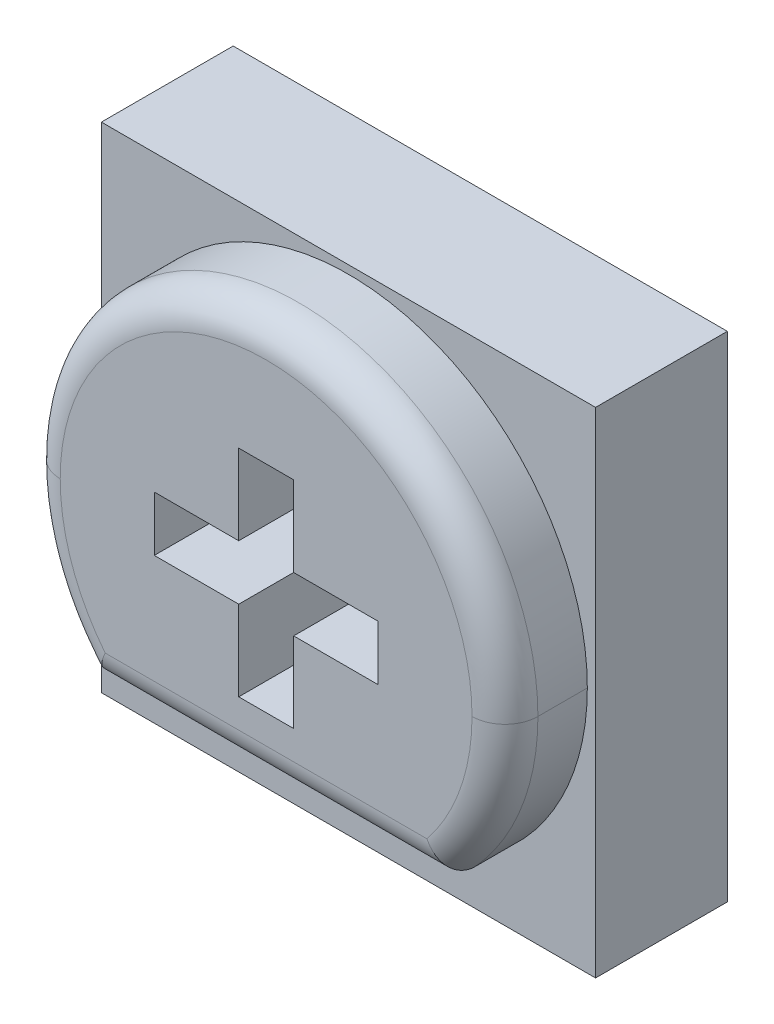
ISO-10303-21;
HEADER;
FILE_DESCRIPTION(('STEP AP214'),'2;1');
FILE_NAME('part.step','',(''),(''),'','','');
FILE_SCHEMA(('AUTOMOTIVE_DESIGN { 1 0 10303 214 1 1 1 1 }'));
ENDSEC;
DATA;
#1=APPLICATION_CONTEXT('core data for automotive mechanical design processes');
#2=APPLICATION_PROTOCOL_DEFINITION('international standard','automotive_design',2000,#1);
#3=PRODUCT_CONTEXT('',#1,'mechanical');
#4=PRODUCT('Part','Part','',(#3));
#5=PRODUCT_RELATED_PRODUCT_CATEGORY('part','',(#4));
#6=PRODUCT_DEFINITION_FORMATION('','',#4);
#7=PRODUCT_DEFINITION_CONTEXT('part definition',#1,'design');
#8=PRODUCT_DEFINITION('design','',#6,#7);
#9=PRODUCT_DEFINITION_SHAPE('','',#8);
#10=(LENGTH_UNIT() NAMED_UNIT(*) SI_UNIT(.MILLI.,.METRE.));
#11=(NAMED_UNIT(*) PLANE_ANGLE_UNIT() SI_UNIT($,.RADIAN.));
#12=(NAMED_UNIT(*) SI_UNIT($,.STERADIAN.) SOLID_ANGLE_UNIT());
#13=UNCERTAINTY_MEASURE_WITH_UNIT(LENGTH_MEASURE(1.E-05),#10,'distance_accuracy_value','');
#14=(GEOMETRIC_REPRESENTATION_CONTEXT(3) GLOBAL_UNCERTAINTY_ASSIGNED_CONTEXT((#13)) GLOBAL_UNIT_ASSIGNED_CONTEXT((#10,
#11,#12)) REPRESENTATION_CONTEXT('',''));
#15=CARTESIAN_POINT('',(0.,0.,0.));
#16=DIRECTION('',(0.,0.,1.));
#17=DIRECTION('',(1.,0.,0.));
#18=AXIS2_PLACEMENT_3D('',#15,#16,#17);
#19=CARTESIAN_POINT('',(0.,-0.780072673595366,1.1));
#20=DIRECTION('',(-1.,0.,0.));
#21=DIRECTION('',(0.,0.,1.));
#22=AXIS2_PLACEMENT_3D('',#19,#20,#21);
#23=CYLINDRICAL_SURFACE('',#22,0.2);
#24=CARTESIAN_POINT('',(-0.976722388353635,-0.780072673595365,1.3));
#25=CARTESIAN_POINT('',(-0.978582876483748,-0.783942428368407,1.30000010662705));
#26=CARTESIAN_POINT('',(-0.980434260622077,-0.78781661448682,1.29988768903877));
#27=CARTESIAN_POINT('',(-0.984068042853532,-0.795458200461184,1.29944304979156));
#28=CARTESIAN_POINT('',(-0.985850965291465,-0.799225697195105,1.29911675995361));
#29=CARTESIAN_POINT('',(-0.989347843964978,-0.806642878237111,1.29826139361799));
#30=CARTESIAN_POINT('',(-0.991062353450871,-0.810292968678736,1.29773810206317));
#31=CARTESIAN_POINT('',(-0.994422362316653,-0.817466103886795,1.29650597830426));
#32=CARTESIAN_POINT('',(-0.996068448082956,-0.820989839335476,1.29580276514015));
#33=CARTESIAN_POINT('',(-0.99929157862629,-0.827902752270505,1.2942279225682));
#34=CARTESIAN_POINT('',(-1.00086924541687,-0.831292879546459,1.29336173521145));
#35=CARTESIAN_POINT('',(-1.00395549999645,-0.837932673977716,1.29147786693144));
#36=CARTESIAN_POINT('',(-1.00546474880103,-0.841183524907789,1.29046544105349));
#37=CARTESIAN_POINT('',(-1.00841412701953,-0.847540366899465,1.2883056886341));
#38=CARTESIAN_POINT('',(-1.0098549600783,-0.850647750876924,1.28716342280461));
#39=CARTESIAN_POINT('',(-1.01266746221992,-0.856714648619868,1.28476015854547));
#40=CARTESIAN_POINT('',(-1.01403988169881,-0.859675740092966,1.28350402122508));
#41=CARTESIAN_POINT('',(-1.01671550807114,-0.865448317772886,1.28088867341865));
#42=CARTESIAN_POINT('',(-1.01801951673766,-0.868261542747201,1.2795341211797));
#43=CARTESIAN_POINT('',(-1.020558267061,-0.873737813577702,1.27673702595328));
#44=CARTESIAN_POINT('',(-1.0217938671395,-0.87640273625624,1.27529893690218));
#45=CARTESIAN_POINT('',(-1.02419574348245,-0.881582875907218,1.2723492192877));
#46=CARTESIAN_POINT('',(-1.02536294065438,-0.884100085606861,1.27084184051065));
#47=CARTESIAN_POINT('',(-1.02762793684647,-0.888986211856132,1.26776731866267));
#48=CARTESIAN_POINT('',(-1.02872672641301,-0.891357215696295,1.26620422292511));
#49=CARTESIAN_POINT('',(-1.03085486556617,-0.895953164103536,1.2630313446476));
#50=CARTESIAN_POINT('',(-1.0318852816206,-0.89818027050945,1.26142540961838));
#51=CARTESIAN_POINT('',(-1.03387648360047,-0.902491410532901,1.25817918009891));
#52=CARTESIAN_POINT('',(-1.03483842596946,-0.904577660235075,1.25654253817552));
#53=CARTESIAN_POINT('',(-1.03669297457826,-0.908610602077788,1.25324657414484));
#54=CARTESIAN_POINT('',(-1.03758681830135,-0.910559550071438,1.25159071105662));
#55=CARTESIAN_POINT('',(-1.03930371780735,-0.914322275004737,1.24826693579304));
#56=CARTESIAN_POINT('',(-1.04012817324538,-0.916138316812218,1.24660230690265));
#57=CARTESIAN_POINT('',(-1.04208567220707,-0.920467707669937,1.24248344323641));
#58=CARTESIAN_POINT('',(-1.04320256258946,-0.92295287236982,1.2399917319032));
#59=CARTESIAN_POINT('',(-1.04536496724724,-0.927774414297937,1.23489394935906));
#60=CARTESIAN_POINT('',(-1.04641111392838,-0.930112092085159,1.2322893749379));
#61=CARTESIAN_POINT('',(-1.04843029420529,-0.934634917492007,1.2269746384858));
#62=CARTESIAN_POINT('',(-1.04940397694238,-0.936821402459521,1.22426586224713));
#63=CARTESIAN_POINT('',(-1.05127868942366,-0.941038002898474,1.21875219984313));
#64=CARTESIAN_POINT('',(-1.05218036051133,-0.943069489212293,1.21594858036964));
#65=CARTESIAN_POINT('',(-1.05391093247813,-0.946973003780872,1.21025459026027));
#66=CARTESIAN_POINT('',(-1.05474047116892,-0.948846424068253,1.20736536822005));
#67=CARTESIAN_POINT('',(-1.05632681553256,-0.952431234553708,1.20150958775003));
#68=CARTESIAN_POINT('',(-1.05708425216595,-0.954144027943474,1.19854405959484));
#69=CARTESIAN_POINT('',(-1.05852639114481,-0.95740557790085,1.19254505067602));
#70=CARTESIAN_POINT('',(-1.05921171610998,-0.958955738244561,1.18951248310666));
#71=CARTESIAN_POINT('',(-1.06050964303854,-0.961890552710986,1.18338873191873));
#72=CARTESIAN_POINT('',(-1.06112285719928,-0.963276600909639,1.18029834643786));
#73=CARTESIAN_POINT('',(-1.06227657301095,-0.965882249336626,1.17406821561177));
#74=CARTESIAN_POINT('',(-1.06281767439884,-0.967103223843364,1.17092915633339));
#75=CARTESIAN_POINT('',(-1.06382717800542,-0.969378294595384,1.16461082689027));
#76=CARTESIAN_POINT('',(-1.06429616535711,-0.970433735552373,1.16143213461483));
#77=CARTESIAN_POINT('',(-1.06516145616436,-0.972377803862266,1.15504355425207));
#78=CARTESIAN_POINT('',(-1.06555832795597,-0.973267737004709,1.15183414067152));
#79=CARTESIAN_POINT('',(-1.06627940532571,-0.974881332832962,1.14539297440089));
#80=CARTESIAN_POINT('',(-1.06660416020488,-0.975606253530085,1.14216159849668));
#81=CARTESIAN_POINT('',(-1.06718102316413,-0.976890822910636,1.13568518165773));
#82=CARTESIAN_POINT('',(-1.0674336592554,-0.977451673609748,1.13244042628605));
#83=CARTESIAN_POINT('',(-1.06786630821027,-0.978409553964949,1.12594572403494));
#84=CARTESIAN_POINT('',(-1.06804682552164,-0.978807721995891,1.12269597874226));
#85=CARTESIAN_POINT('',(-1.06833525580482,-0.979442058057056,1.11619953598342));
#86=CARTESIAN_POINT('',(-1.06844364747126,-0.97967929439247,1.11295296417933));
#87=CARTESIAN_POINT('',(-1.06858787325372,-0.979994166377215,1.10647090549435));
#88=CARTESIAN_POINT('',(-1.06862415795581,-0.980072793201553,1.10323547670629));
#89=CARTESIAN_POINT('',(-1.06862414088005,-0.980072673595366,1.1));
#90=B_SPLINE_CURVE_WITH_KNOTS('',3,(#24,#25,#26,#27,#28,#29,#30,#31,#32,#33,#34,#35,#36,#37,#38,
#39,#40,#41,#42,#43,#44,#45,#46,#47,#48,#49,#50,#51,#52,#53,#54,#55,#56,#57,#58,#59,#60,#61,#62,
#63,#64,#65,#66,#67,#68,#69,#70,#71,#72,#73,#74,#75,#76,#77,#78,#79,#80,#81,#82,#83,#84,#85,#86,
#87,#88,#89),.UNSPECIFIED.,.F.,.F.,(4,2,2,2,2,2,2,2,2,2,2,2,2,2,2,2,2,2,2,2,2,2,2,2,2,2,2,2,2,2,
2,2,4),(0.,0.0128798643907271,0.0254168111871587,0.0376111761819841,0.0494633248166605,
0.0609736556606268,0.0721426044121531,0.0829706485163055,0.0934583125162377,0.103606174279954,
0.113414872277339,0.122885114123568,0.13201768665766,0.140813467892352,0.149273441258434,
0.157398712679542,0.165190531160782,0.176261521102339,0.187214853640435,0.198053862441838,
0.208781987753394,0.219402777577811,0.229919888553356,0.240337086503167,0.250658246619516,
0.260887353248586,0.271028499242076,0.281085884843466,0.291063816078963,0.300966702626154,
0.310799055137271,0.320565481998601,0.330270685513171),.UNSPECIFIED.);
#91=CARTESIAN_POINT('',(-0.976722388353635,-0.780072673594436,1.3));
#92=VERTEX_POINT('',#91);
#93=CARTESIAN_POINT('',(-1.06862414088005,-0.980072673595366,1.1));
#94=VERTEX_POINT('',#93);
#95=EDGE_CURVE('E11',#92,#94,#90,.T.);
#96=ORIENTED_EDGE('',*,*,#95,.T.);
#97=DIRECTION('',(-1.,0.,0.));
#98=VECTOR('',#97,1.);
#99=CARTESIAN_POINT('',(-1.06862414088005,-0.980072673595366,1.1));
#100=LINE('',#99,#98);
#101=CARTESIAN_POINT('',(1.06862414088005,-0.980072673595366,1.1));
#102=VERTEX_POINT('',#101);
#103=EDGE_CURVE('E307',#102,#94,#100,.T.);
#104=ORIENTED_EDGE('',*,*,#103,.F.);
#105=CARTESIAN_POINT('',(1.06862414088005,-0.980072673595366,1.1));
#106=CARTESIAN_POINT('',(1.06862415790463,-0.980072793161405,1.10323501885855));
#107=CARTESIAN_POINT('',(1.06858787014738,-0.979994188595952,1.10646998968196));
#108=CARTESIAN_POINT('',(1.06844363555318,-0.979679401920801,1.11295121111512));
#109=CARTESIAN_POINT('',(1.06833523638055,-0.979442225082035,1.11619740342594));
#110=CARTESIAN_POINT('',(1.06804678841329,-0.978808037915209,1.12269316798305));
#111=CARTESIAN_POINT('',(1.0678662592102,-0.978409955695832,1.12594261415052));
#112=CARTESIAN_POINT('',(1.06743358374542,-0.977452265705593,1.13243680007929));
#113=CARTESIAN_POINT('',(1.06718093136514,-0.976891515961146,1.13568133762672));
#114=CARTESIAN_POINT('',(1.06660403306032,-0.975607155967753,1.14215740077891));
#115=CARTESIAN_POINT('',(1.06627925750309,-0.974882340106026,1.14538863998265));
#116=CARTESIAN_POINT('',(1.06555813595711,-0.973268950131116,1.15182961374495));
#117=CARTESIAN_POINT('',(1.06516123910061,-0.972379114426444,1.15503897047008));
#118=CARTESIAN_POINT('',(1.06429589528706,-0.970435225948222,1.1614275158165));
#119=CARTESIAN_POINT('',(1.0638268784866,-0.969379863836404,1.16460622867592));
#120=CARTESIAN_POINT('',(1.06281731304553,-0.967104924671163,1.17092467464717));
#121=CARTESIAN_POINT('',(1.06227617782755,-0.965883999402918,1.17406382840996));
#122=CARTESIAN_POINT('',(1.06112239135304,-0.963278412559076,1.18029421909145));
#123=CARTESIAN_POINT('',(1.06050913898096,-0.961892373261247,1.18338476828253));
#124=CARTESIAN_POINT('',(1.0592111325665,-0.95895752928339,1.1895089121736));
#125=CARTESIAN_POINT('',(1.05852576501605,-0.957407327156057,1.19254170687831));
#126=CARTESIAN_POINT('',(1.05708353771209,-0.954145636384646,1.19854122862351));
#127=CARTESIAN_POINT('',(1.05632605409692,-0.952432740678393,1.20150704041988));
#128=CARTESIAN_POINT('',(1.0547396126331,-0.948847658937547,1.20736343893423));
#129=CARTESIAN_POINT('',(1.05391002265254,-0.946974066522486,1.21025299314087));
#130=CARTESIAN_POINT('',(1.05217934456879,-0.943070132493851,1.21594768939739));
#131=CARTESIAN_POINT('',(1.05127761754805,-0.941038395769432,1.21875168043219));
#132=CARTESIAN_POINT('',(1.04940279085237,-0.936821211132242,1.22426611817609));
#133=CARTESIAN_POINT('',(1.04842904881215,-0.934634389416236,1.2269752956015));
#134=CARTESIAN_POINT('',(1.04640974272993,-0.9301108013382,1.23229085469895));
#135=CARTESIAN_POINT('',(1.04536352853366,-0.927772694815,1.23489584780285));
#136=CARTESIAN_POINT('',(1.04320099975805,-0.922950195843846,1.23999448041842));
#137=CARTESIAN_POINT('',(1.04208405205195,-0.920464500110525,1.24248662025425));
#138=CARTESIAN_POINT('',(1.04012686911423,-0.916135158338833,1.24660522336567));
#139=CARTESIAN_POINT('',(1.03930281403785,-0.914319736746141,1.24826921929074));
#140=CARTESIAN_POINT('',(1.03758666070683,-0.910558219473953,1.25159184326611));
#141=CARTESIAN_POINT('',(1.03669315987989,-0.908609857860175,1.25324718532612));
#142=CARTESIAN_POINT('',(1.03483925419172,-0.904578045228244,1.25654222045205));
#143=CARTESIAN_POINT('',(1.03387760986934,-0.902492336966285,1.25817845171438));
#144=CARTESIAN_POINT('',(1.03188695733766,-0.898182228796339,1.26142396705059));
#145=CARTESIAN_POINT('',(1.03085679082111,-0.895955611292947,1.26302959550577));
#146=CARTESIAN_POINT('',(1.02872910483605,-0.891360580949605,1.26620196157212));
#147=CARTESIAN_POINT('',(1.02763051732048,-0.888990004620983,1.26776484837798));
#148=CARTESIAN_POINT('',(1.02536587881754,-0.884104665201275,1.270839045563));
#149=CARTESIAN_POINT('',(1.02419883589516,-0.881587813077026,1.27234630503816));
#150=CARTESIAN_POINT('',(1.02179722153228,-0.876408311980484,1.27529586827567));
#151=CARTESIAN_POINT('',(1.02056172797285,-0.87374366847777,1.27673391838907));
#152=CARTESIAN_POINT('',(1.01802314398466,-0.868267871349357,1.27953100960079));
#153=CARTESIAN_POINT('',(1.01671919407088,-0.865454839077353,1.28088559258959));
#154=CARTESIAN_POINT('',(1.01404363836945,-0.859682554624791,1.28350106399332));
#155=CARTESIAN_POINT('',(1.01267122987399,-0.856721561873554,1.28475728966257));
#156=CARTESIAN_POINT('',(1.00985870274354,-0.850654762627129,1.28716077953568));
#157=CARTESIAN_POINT('',(1.00841783288863,-0.84754737668662,1.28830317779404));
#158=CARTESIAN_POINT('',(1.00546833401955,-0.841190426044895,1.29046322940207));
#159=CARTESIAN_POINT('',(1.00395900063283,-0.837939466802953,1.2914758168573));
#160=CARTESIAN_POINT('',(1.00087252974065,-0.83129934649203,1.29336002667376));
#161=CARTESIAN_POINT('',(0.999294730575505,-0.827909000186218,1.29422638845632));
#162=CARTESIAN_POINT('',(0.996071288057848,-0.820995536908047,1.29580158102119));
#163=CARTESIAN_POINT('',(0.994425022120679,-0.817471468899134,1.29650496386808));
#164=CARTESIAN_POINT('',(0.991064605615255,-0.810297555034523,1.29773740971588));
#165=CARTESIAN_POINT('',(0.989349868153072,-0.806647017519145,1.29826084744706));
#166=CARTESIAN_POINT('',(0.985852486187445,-0.799228829574676,1.29911646938995));
#167=CARTESIAN_POINT('',(0.984069287982963,-0.795460772360033,1.29944286209294));
#168=CARTESIAN_POINT('',(0.980434906754333,-0.787817955794568,1.29988765009065));
#169=CARTESIAN_POINT('',(0.978583198980793,-0.783943099296896,1.30000010668523));
#170=CARTESIAN_POINT('',(0.976722388353635,-0.780072673595365,1.3));
#171=B_SPLINE_CURVE_WITH_KNOTS('',3,(#105,#106,#107,#108,#109,#110,#111,#112,#113,#114,#115,
#116,#117,#118,#119,#120,#121,#122,#123,#124,#125,#126,#127,#128,#129,#130,#131,#132,#133,#134,
#135,#136,#137,#138,#139,#140,#141,#142,#143,#144,#145,#146,#147,#148,#149,#150,#151,#152,#153,
#154,#155,#156,#157,#158,#159,#160,#161,#162,#163,#164,#165,#166,#167,#168,#169,#170),
.UNSPECIFIED.,.F.,.F.,(4,2,2,2,2,2,2,2,2,2,2,2,2,2,2,2,2,2,2,2,2,2,2,2,2,2,2,2,2,2,2,2,4),(0.,
0.00970383015639041,0.0194691111408278,0.0293005460425884,0.0392027436866783,0.0491802148332466,
0.0592373689551338,0.0693785115803201,0.0796078421805294,0.0899294525825833,0.100347325875266,
0.110865335781494,0.121487246463379,0.132216712726339,0.143057280587636,0.154012388174575,
0.165085366917928,0.172874288339563,0.180997000652246,0.18945475428177,0.198248656233392,
0.207379690754197,0.216848736464828,0.226656580648037,0.236803931233077,0.247291426901338,
0.258119645651113,0.269289112091529,0.280800303682738,0.292653656097926,0.304849567849835,
0.317388404298482,0.33027050113589),.UNSPECIFIED.);
#172=CARTESIAN_POINT('',(0.976722388353635,-0.780072673594436,1.3));
#173=VERTEX_POINT('',#172);
#174=EDGE_CURVE('E258',#102,#173,#171,.T.);
#175=ORIENTED_EDGE('',*,*,#174,.T.);
#176=DIRECTION('',(1.,0.,0.));
#177=VECTOR('',#176,1.);
#178=CARTESIAN_POINT('',(1.06862414088005,-0.780072673595366,1.3));
#179=LINE('',#178,#177);
#180=EDGE_CURVE('E466',#92,#173,#179,.T.);
#181=ORIENTED_EDGE('',*,*,#180,.F.);
#182=EDGE_LOOP('',(#96,#104,#175,#181));
#183=FACE_BOUND('',#182,.T.);
#184=ADVANCED_FACE('F16',(#183),#23,.T.);
#185=CARTESIAN_POINT('',(0.,0.,1.1));
#186=DIRECTION('',(0.,0.,1.));
#187=DIRECTION('',(1.,0.,0.));
#188=AXIS2_PLACEMENT_3D('',#185,#186,#187);
#189=TOROIDAL_SURFACE('',#188,1.25,0.2);
#190=CARTESIAN_POINT('',(-1.25,0.,1.1));
#191=DIRECTION('',(0.,1.,0.));
#192=DIRECTION('',(-1.,0.,0.));
#193=AXIS2_PLACEMENT_3D('',#190,#191,#192);
#194=CIRCLE('',#193,0.2);
#195=CARTESIAN_POINT('',(-1.45,0.,1.1));
#196=VERTEX_POINT('',#195);
#197=CARTESIAN_POINT('',(-1.25,0.,1.3));
#198=VERTEX_POINT('',#197);
#199=EDGE_CURVE('E428',#196,#198,#194,.T.);
#200=ORIENTED_EDGE('',*,*,#199,.F.);
#201=CARTESIAN_POINT('',(0.,0.,1.1));
#202=DIRECTION('',(0.,0.,-1.));
#203=DIRECTION('',(1.,0.,0.));
#204=AXIS2_PLACEMENT_3D('',#201,#202,#203);
#205=CIRCLE('',#204,1.45);
#206=EDGE_CURVE('E583',#94,#196,#205,.T.);
#207=ORIENTED_EDGE('',*,*,#206,.F.);
#208=ORIENTED_EDGE('',*,*,#95,.F.);
#209=CARTESIAN_POINT('',(0.,0.,1.3));
#210=DIRECTION('',(0.,0.,1.));
#211=DIRECTION('',(1.,0.,0.));
#212=AXIS2_PLACEMENT_3D('',#209,#210,#211);
#213=CIRCLE('',#212,1.25);
#214=EDGE_CURVE('E601',#198,#92,#213,.T.);
#215=ORIENTED_EDGE('',*,*,#214,.F.);
#216=EDGE_LOOP('',(#200,#207,#208,#215));
#217=FACE_BOUND('',#216,.T.);
#218=ADVANCED_FACE('F235',(#217),#189,.T.);
#219=CARTESIAN_POINT('',(0.,0.,0.5));
#220=DIRECTION('',(0.,0.,1.));
#221=DIRECTION('',(1.,0.,0.));
#222=AXIS2_PLACEMENT_3D('',#219,#220,#221);
#223=PLANE('',#222);
#224=DIRECTION('',(1.,0.,0.));
#225=VECTOR('',#224,1.);
#226=CARTESIAN_POINT('',(-0.6790503810102,0.215595899480311,0.5));
#227=LINE('',#226,#225);
#228=CARTESIAN_POINT('',(-0.6790503810102,0.215595899480311,0.5));
#229=VERTEX_POINT('',#228);
#230=CARTESIAN_POINT('',(-0.166229868189688,0.215595899480311,0.5));
#231=VERTEX_POINT('',#230);
#232=EDGE_CURVE('E353',#229,#231,#227,.T.);
#233=ORIENTED_EDGE('',*,*,#232,.F.);
#234=DIRECTION('',(0.,1.,0.));
#235=VECTOR('',#234,1.);
#236=CARTESIAN_POINT('',(-0.6790503810102,-0.117737433853022,0.5));
#237=LINE('',#236,#235);
#238=CARTESIAN_POINT('',(-0.6790503810102,-0.117737433853022,0.5));
#239=VERTEX_POINT('',#238);
#240=EDGE_CURVE('E27',#239,#229,#237,.T.);
#241=ORIENTED_EDGE('',*,*,#240,.F.);
#242=DIRECTION('',(-1.,0.,0.));
#243=VECTOR('',#242,1.);
#244=CARTESIAN_POINT('',(-0.166229868189688,-0.117737433853022,0.5));
#245=LINE('',#244,#243);
#246=CARTESIAN_POINT('',(-0.166229868189688,-0.117737433853022,0.5));
#247=VERTEX_POINT('',#246);
#248=EDGE_CURVE('E357',#247,#239,#245,.T.);
#249=ORIENTED_EDGE('',*,*,#248,.F.);
#250=DIRECTION('',(0.,1.,0.));
#251=VECTOR('',#250,1.);
#252=CARTESIAN_POINT('',(-0.166229868189688,-0.60491692103251,0.5));
#253=LINE('',#252,#251);
#254=CARTESIAN_POINT('',(-0.166229868189688,-0.60491692103251,0.5));
#255=VERTEX_POINT('',#254);
#256=EDGE_CURVE('E341',#255,#247,#253,.T.);
#257=ORIENTED_EDGE('',*,*,#256,.F.);
#258=DIRECTION('',(-1.,0.,0.));
#259=VECTOR('',#258,1.);
#260=CARTESIAN_POINT('',(0.167103465143646,-0.60491692103251,0.5));
#261=LINE('',#260,#259);
#262=CARTESIAN_POINT('',(0.167103465143646,-0.60491692103251,0.5));
#263=VERTEX_POINT('',#262);
#264=EDGE_CURVE('E330',#263,#255,#261,.T.);
#265=ORIENTED_EDGE('',*,*,#264,.F.);
#266=DIRECTION('',(0.,-1.,0.));
#267=VECTOR('',#266,1.);
#268=CARTESIAN_POINT('',(0.167103465143646,-0.117737433853022,0.5));
#269=LINE('',#268,#267);
#270=CARTESIAN_POINT('',(0.167103465143646,-0.117737433853022,0.5));
#271=VERTEX_POINT('',#270);
#272=EDGE_CURVE('E386',#271,#263,#269,.T.);
#273=ORIENTED_EDGE('',*,*,#272,.F.);
#274=DIRECTION('',(-1.,0.,0.));
#275=VECTOR('',#274,1.);
#276=CARTESIAN_POINT('',(0.679923977964159,-0.117737433853022,0.5));
#277=LINE('',#276,#275);
#278=CARTESIAN_POINT('',(0.679923977964159,-0.117737433853022,0.5));
#279=VERTEX_POINT('',#278);
#280=EDGE_CURVE('E184',#279,#271,#277,.T.);
#281=ORIENTED_EDGE('',*,*,#280,.F.);
#282=DIRECTION('',(0.,-1.,0.));
#283=VECTOR('',#282,1.);
#284=CARTESIAN_POINT('',(0.679923977964159,0.215595899480311,0.5));
#285=LINE('',#284,#283);
#286=CARTESIAN_POINT('',(0.679923977964159,0.215595899480311,0.5));
#287=VERTEX_POINT('',#286);
#288=EDGE_CURVE('E175',#287,#279,#285,.T.);
#289=ORIENTED_EDGE('',*,*,#288,.F.);
#290=DIRECTION('',(1.,0.,0.));
#291=VECTOR('',#290,1.);
#292=CARTESIAN_POINT('',(0.167103465143646,0.215595899480311,0.5));
#293=LINE('',#292,#291);
#294=CARTESIAN_POINT('',(0.167103465143646,0.215595899480311,0.5));
#295=VERTEX_POINT('',#294);
#296=EDGE_CURVE('E180',#295,#287,#293,.T.);
#297=ORIENTED_EDGE('',*,*,#296,.F.);
#298=DIRECTION('',(0.,-1.,0.));
#299=VECTOR('',#298,1.);
#300=CARTESIAN_POINT('',(0.167103465143646,0.702775386659798,0.5));
#301=LINE('',#300,#299);
#302=CARTESIAN_POINT('',(0.167103465143646,0.702775386659798,0.5));
#303=VERTEX_POINT('',#302);
#304=EDGE_CURVE('E211',#303,#295,#301,.T.);
#305=ORIENTED_EDGE('',*,*,#304,.F.);
#306=DIRECTION('',(1.,0.,0.));
#307=VECTOR('',#306,1.);
#308=CARTESIAN_POINT('',(-0.166229868189688,0.702775386659798,0.5));
#309=LINE('',#308,#307);
#310=CARTESIAN_POINT('',(-0.166229868189688,0.702775386659798,0.5));
#311=VERTEX_POINT('',#310);
#312=EDGE_CURVE('E447',#311,#303,#309,.T.);
#313=ORIENTED_EDGE('',*,*,#312,.F.);
#314=DIRECTION('',(0.,1.,0.));
#315=VECTOR('',#314,1.);
#316=CARTESIAN_POINT('',(-0.166229868189688,0.215595899480311,0.5));
#317=LINE('',#316,#315);
#318=EDGE_CURVE('E352',#231,#311,#317,.T.);
#319=ORIENTED_EDGE('',*,*,#318,.F.);
#320=EDGE_LOOP('',(#233,#241,#249,#257,#265,#273,#281,#289,#297,#305,#313,#319));
#321=FACE_BOUND('',#320,.T.);
#322=ADVANCED_FACE('F177',(#321),#223,.T.);
#323=CARTESIAN_POINT('',(-0.6790503810102,-0.117737433853022,0.5));
#324=DIRECTION('',(1.,0.,0.));
#325=DIRECTION('',(0.,1.,0.));
#326=AXIS2_PLACEMENT_3D('',#323,#324,#325);
#327=PLANE('',#326);
#328=DIRECTION('',(0.,1.,0.));
#329=VECTOR('',#328,1.);
#330=CARTESIAN_POINT('',(-0.6790503810102,-0.117737433853022,1.3));
#331=LINE('',#330,#329);
#332=CARTESIAN_POINT('',(-0.6790503810102,-0.117737433853022,1.3));
#333=VERTEX_POINT('',#332);
#334=CARTESIAN_POINT('',(-0.6790503810102,0.215595899480311,1.3));
#335=VERTEX_POINT('',#334);
#336=EDGE_CURVE('E380',#333,#335,#331,.T.);
#337=ORIENTED_EDGE('',*,*,#336,.F.);
#338=DIRECTION('',(0.,0.,1.));
#339=VECTOR('',#338,1.);
#340=CARTESIAN_POINT('',(-0.6790503810102,-0.117737433853022,0.5));
#341=LINE('',#340,#339);
#342=EDGE_CURVE('E354',#239,#333,#341,.T.);
#343=ORIENTED_EDGE('',*,*,#342,.F.);
#344=ORIENTED_EDGE('',*,*,#240,.T.);
#345=DIRECTION('',(0.,0.,1.));
#346=VECTOR('',#345,1.);
#347=CARTESIAN_POINT('',(-0.6790503810102,0.215595899480311,0.5));
#348=LINE('',#347,#346);
#349=EDGE_CURVE('E317',#229,#335,#348,.T.);
#350=ORIENTED_EDGE('',*,*,#349,.T.);
#351=EDGE_LOOP('',(#337,#343,#344,#350));
#352=FACE_BOUND('',#351,.T.);
#353=ADVANCED_FACE('F290',(#352),#327,.T.);
#354=CARTESIAN_POINT('',(-0.166229868189688,-0.117737433853022,0.5));
#355=DIRECTION('',(0.,1.,0.));
#356=DIRECTION('',(1.,0.,0.));
#357=AXIS2_PLACEMENT_3D('',#354,#355,#356);
#358=PLANE('',#357);
#359=DIRECTION('',(-1.,0.,0.));
#360=VECTOR('',#359,1.);
#361=CARTESIAN_POINT('',(-0.166229868189688,-0.117737433853022,1.3));
#362=LINE('',#361,#360);
#363=CARTESIAN_POINT('',(-0.166229868189688,-0.117737433853022,1.3));
#364=VERTEX_POINT('',#363);
#365=EDGE_CURVE('E370',#364,#333,#362,.T.);
#366=ORIENTED_EDGE('',*,*,#365,.F.);
#367=DIRECTION('',(0.,0.,1.));
#368=VECTOR('',#367,1.);
#369=CARTESIAN_POINT('',(-0.166229868189688,-0.117737433853022,0.5));
#370=LINE('',#369,#368);
#371=EDGE_CURVE('E439',#247,#364,#370,.T.);
#372=ORIENTED_EDGE('',*,*,#371,.F.);
#373=ORIENTED_EDGE('',*,*,#248,.T.);
#374=ORIENTED_EDGE('',*,*,#342,.T.);
#375=EDGE_LOOP('',(#366,#372,#373,#374));
#376=FACE_BOUND('',#375,.T.);
#377=ADVANCED_FACE('F286',(#376),#358,.T.);
#378=CARTESIAN_POINT('',(-0.166229868189688,-0.60491692103251,0.5));
#379=DIRECTION('',(1.,0.,0.));
#380=DIRECTION('',(0.,1.,0.));
#381=AXIS2_PLACEMENT_3D('',#378,#379,#380);
#382=PLANE('',#381);
#383=DIRECTION('',(0.,1.,0.));
#384=VECTOR('',#383,1.);
#385=CARTESIAN_POINT('',(-0.166229868189688,-0.60491692103251,1.3));
#386=LINE('',#385,#384);
#387=CARTESIAN_POINT('',(-0.166229868189688,-0.60491692103251,1.3));
#388=VERTEX_POINT('',#387);
#389=EDGE_CURVE('E494',#388,#364,#386,.T.);
#390=ORIENTED_EDGE('',*,*,#389,.F.);
#391=DIRECTION('',(0.,0.,1.));
#392=VECTOR('',#391,1.);
#393=CARTESIAN_POINT('',(-0.166229868189688,-0.60491692103251,0.5));
#394=LINE('',#393,#392);
#395=EDGE_CURVE('E334',#255,#388,#394,.T.);
#396=ORIENTED_EDGE('',*,*,#395,.F.);
#397=ORIENTED_EDGE('',*,*,#256,.T.);
#398=ORIENTED_EDGE('',*,*,#371,.T.);
#399=EDGE_LOOP('',(#390,#396,#397,#398));
#400=FACE_BOUND('',#399,.T.);
#401=ADVANCED_FACE('F289',(#400),#382,.T.);
#402=CARTESIAN_POINT('',(0.167103465143646,-0.60491692103251,0.5));
#403=DIRECTION('',(0.,1.,0.));
#404=DIRECTION('',(1.,0.,0.));
#405=AXIS2_PLACEMENT_3D('',#402,#403,#404);
#406=PLANE('',#405);
#407=DIRECTION('',(-1.,0.,0.));
#408=VECTOR('',#407,1.);
#409=CARTESIAN_POINT('',(0.167103465143646,-0.60491692103251,1.3));
#410=LINE('',#409,#408);
#411=CARTESIAN_POINT('',(0.167103465143646,-0.60491692103251,1.3));
#412=VERTEX_POINT('',#411);
#413=EDGE_CURVE('E436',#412,#388,#410,.T.);
#414=ORIENTED_EDGE('',*,*,#413,.F.);
#415=DIRECTION('',(0.,0.,1.));
#416=VECTOR('',#415,1.);
#417=CARTESIAN_POINT('',(0.167103465143646,-0.60491692103251,0.5));
#418=LINE('',#417,#416);
#419=EDGE_CURVE('E335',#263,#412,#418,.T.);
#420=ORIENTED_EDGE('',*,*,#419,.F.);
#421=ORIENTED_EDGE('',*,*,#264,.T.);
#422=ORIENTED_EDGE('',*,*,#395,.T.);
#423=EDGE_LOOP('',(#414,#420,#421,#422));
#424=FACE_BOUND('',#423,.T.);
#425=ADVANCED_FACE('F632',(#424),#406,.T.);
#426=CARTESIAN_POINT('',(0.167103465143646,-0.117737433853022,0.5));
#427=DIRECTION('',(-1.,0.,0.));
#428=DIRECTION('',(0.,0.,1.));
#429=AXIS2_PLACEMENT_3D('',#426,#427,#428);
#430=PLANE('',#429);
#431=DIRECTION('',(0.,-1.,0.));
#432=VECTOR('',#431,1.);
#433=CARTESIAN_POINT('',(0.167103465143646,-0.117737433853022,1.3));
#434=LINE('',#433,#432);
#435=CARTESIAN_POINT('',(0.167103465143646,-0.117737433853022,1.3));
#436=VERTEX_POINT('',#435);
#437=EDGE_CURVE('E361',#436,#412,#434,.T.);
#438=ORIENTED_EDGE('',*,*,#437,.F.);
#439=DIRECTION('',(0.,0.,1.));
#440=VECTOR('',#439,1.);
#441=CARTESIAN_POINT('',(0.167103465143646,-0.117737433853022,0.5));
#442=LINE('',#441,#440);
#443=EDGE_CURVE('E384',#271,#436,#442,.T.);
#444=ORIENTED_EDGE('',*,*,#443,.F.);
#445=ORIENTED_EDGE('',*,*,#272,.T.);
#446=ORIENTED_EDGE('',*,*,#419,.T.);
#447=EDGE_LOOP('',(#438,#444,#445,#446));
#448=FACE_BOUND('',#447,.T.);
#449=ADVANCED_FACE('F18',(#448),#430,.T.);
#450=CARTESIAN_POINT('',(0.679923977964159,-0.117737433853022,0.5));
#451=DIRECTION('',(0.,1.,0.));
#452=DIRECTION('',(1.,0.,0.));
#453=AXIS2_PLACEMENT_3D('',#450,#451,#452);
#454=PLANE('',#453);
#455=DIRECTION('',(-1.,0.,0.));
#456=VECTOR('',#455,1.);
#457=CARTESIAN_POINT('',(0.679923977964159,-0.117737433853022,1.3));
#458=LINE('',#457,#456);
#459=CARTESIAN_POINT('',(0.679923977964159,-0.117737433853022,1.3));
#460=VERTEX_POINT('',#459);
#461=EDGE_CURVE('E358',#460,#436,#458,.T.);
#462=ORIENTED_EDGE('',*,*,#461,.F.);
#463=DIRECTION('',(0.,0.,1.));
#464=VECTOR('',#463,1.);
#465=CARTESIAN_POINT('',(0.679923977964159,-0.117737433853022,0.5));
#466=LINE('',#465,#464);
#467=EDGE_CURVE('E189',#279,#460,#466,.T.);
#468=ORIENTED_EDGE('',*,*,#467,.F.);
#469=ORIENTED_EDGE('',*,*,#280,.T.);
#470=ORIENTED_EDGE('',*,*,#443,.T.);
#471=EDGE_LOOP('',(#462,#468,#469,#470));
#472=FACE_BOUND('',#471,.T.);
#473=ADVANCED_FACE('F236',(#472),#454,.T.);
#474=CARTESIAN_POINT('',(0.679923977964159,0.215595899480311,0.5));
#475=DIRECTION('',(-1.,0.,0.));
#476=DIRECTION('',(0.,0.,1.));
#477=AXIS2_PLACEMENT_3D('',#474,#475,#476);
#478=PLANE('',#477);
#479=DIRECTION('',(0.,-1.,0.));
#480=VECTOR('',#479,1.);
#481=CARTESIAN_POINT('',(0.679923977964159,0.215595899480311,1.3));
#482=LINE('',#481,#480);
#483=CARTESIAN_POINT('',(0.679923977964159,0.215595899480311,1.3));
#484=VERTEX_POINT('',#483);
#485=EDGE_CURVE('E196',#484,#460,#482,.T.);
#486=ORIENTED_EDGE('',*,*,#485,.F.);
#487=DIRECTION('',(0.,0.,1.));
#488=VECTOR('',#487,1.);
#489=CARTESIAN_POINT('',(0.679923977964159,0.215595899480311,0.5));
#490=LINE('',#489,#488);
#491=EDGE_CURVE('E190',#287,#484,#490,.T.);
#492=ORIENTED_EDGE('',*,*,#491,.F.);
#493=ORIENTED_EDGE('',*,*,#288,.T.);
#494=ORIENTED_EDGE('',*,*,#467,.T.);
#495=EDGE_LOOP('',(#486,#492,#493,#494));
#496=FACE_BOUND('',#495,.T.);
#497=ADVANCED_FACE('F194',(#496),#478,.T.);
#498=CARTESIAN_POINT('',(0.167103465143646,0.215595899480311,0.5));
#499=DIRECTION('',(0.,-1.,0.));
#500=DIRECTION('',(0.,0.,-1.));
#501=AXIS2_PLACEMENT_3D('',#498,#499,#500);
#502=PLANE('',#501);
#503=DIRECTION('',(1.,0.,0.));
#504=VECTOR('',#503,1.);
#505=CARTESIAN_POINT('',(0.167103465143646,0.215595899480311,1.3));
#506=LINE('',#505,#504);
#507=CARTESIAN_POINT('',(0.167103465143646,0.215595899480311,1.3));
#508=VERTEX_POINT('',#507);
#509=EDGE_CURVE('E457',#508,#484,#506,.T.);
#510=ORIENTED_EDGE('',*,*,#509,.F.);
#511=DIRECTION('',(0.,0.,1.));
#512=VECTOR('',#511,1.);
#513=CARTESIAN_POINT('',(0.167103465143646,0.215595899480311,0.5));
#514=LINE('',#513,#512);
#515=EDGE_CURVE('E203',#295,#508,#514,.T.);
#516=ORIENTED_EDGE('',*,*,#515,.F.);
#517=ORIENTED_EDGE('',*,*,#296,.T.);
#518=ORIENTED_EDGE('',*,*,#491,.T.);
#519=EDGE_LOOP('',(#510,#516,#517,#518));
#520=FACE_BOUND('',#519,.T.);
#521=ADVANCED_FACE('F202',(#520),#502,.T.);
#522=CARTESIAN_POINT('',(0.167103465143646,0.702775386659798,0.5));
#523=DIRECTION('',(-1.,0.,0.));
#524=DIRECTION('',(0.,0.,1.));
#525=AXIS2_PLACEMENT_3D('',#522,#523,#524);
#526=PLANE('',#525);
#527=DIRECTION('',(0.,-1.,0.));
#528=VECTOR('',#527,1.);
#529=CARTESIAN_POINT('',(0.167103465143646,0.702775386659798,1.3));
#530=LINE('',#529,#528);
#531=CARTESIAN_POINT('',(0.167103465143646,0.702775386659798,1.3));
#532=VERTEX_POINT('',#531);
#533=EDGE_CURVE('E460',#532,#508,#530,.T.);
#534=ORIENTED_EDGE('',*,*,#533,.F.);
#535=DIRECTION('',(0.,0.,1.));
#536=VECTOR('',#535,1.);
#537=CARTESIAN_POINT('',(0.167103465143646,0.702775386659798,0.5));
#538=LINE('',#537,#536);
#539=EDGE_CURVE('E338',#303,#532,#538,.T.);
#540=ORIENTED_EDGE('',*,*,#539,.F.);
#541=ORIENTED_EDGE('',*,*,#304,.T.);
#542=ORIENTED_EDGE('',*,*,#515,.T.);
#543=EDGE_LOOP('',(#534,#540,#541,#542));
#544=FACE_BOUND('',#543,.T.);
#545=ADVANCED_FACE('F527',(#544),#526,.T.);
#546=CARTESIAN_POINT('',(-0.166229868189688,0.702775386659798,0.5));
#547=DIRECTION('',(0.,-1.,0.));
#548=DIRECTION('',(0.,0.,-1.));
#549=AXIS2_PLACEMENT_3D('',#546,#547,#548);
#550=PLANE('',#549);
#551=DIRECTION('',(1.,0.,0.));
#552=VECTOR('',#551,1.);
#553=CARTESIAN_POINT('',(-0.166229868189688,0.702775386659798,1.3));
#554=LINE('',#553,#552);
#555=CARTESIAN_POINT('',(-0.166229868189688,0.702775386659798,1.3));
#556=VERTEX_POINT('',#555);
#557=EDGE_CURVE('E346',#556,#532,#554,.T.);
#558=ORIENTED_EDGE('',*,*,#557,.F.);
#559=DIRECTION('',(0.,0.,1.));
#560=VECTOR('',#559,1.);
#561=CARTESIAN_POINT('',(-0.166229868189688,0.702775386659798,0.5));
#562=LINE('',#561,#560);
#563=EDGE_CURVE('E444',#311,#556,#562,.T.);
#564=ORIENTED_EDGE('',*,*,#563,.F.);
#565=ORIENTED_EDGE('',*,*,#312,.T.);
#566=ORIENTED_EDGE('',*,*,#539,.T.);
#567=EDGE_LOOP('',(#558,#564,#565,#566));
#568=FACE_BOUND('',#567,.T.);
#569=ADVANCED_FACE('F524',(#568),#550,.T.);
#570=CARTESIAN_POINT('',(-0.166229868189688,0.215595899480311,0.5));
#571=DIRECTION('',(1.,0.,0.));
#572=DIRECTION('',(0.,1.,0.));
#573=AXIS2_PLACEMENT_3D('',#570,#571,#572);
#574=PLANE('',#573);
#575=DIRECTION('',(0.,1.,0.));
#576=VECTOR('',#575,1.);
#577=CARTESIAN_POINT('',(-0.166229868189688,0.215595899480311,1.3));
#578=LINE('',#577,#576);
#579=CARTESIAN_POINT('',(-0.166229868189688,0.215595899480311,1.3));
#580=VERTEX_POINT('',#579);
#581=EDGE_CURVE('E342',#580,#556,#578,.T.);
#582=ORIENTED_EDGE('',*,*,#581,.F.);
#583=DIRECTION('',(0.,0.,1.));
#584=VECTOR('',#583,1.);
#585=CARTESIAN_POINT('',(-0.166229868189688,0.215595899480311,0.5));
#586=LINE('',#585,#584);
#587=EDGE_CURVE('E348',#231,#580,#586,.T.);
#588=ORIENTED_EDGE('',*,*,#587,.F.);
#589=ORIENTED_EDGE('',*,*,#318,.T.);
#590=ORIENTED_EDGE('',*,*,#563,.T.);
#591=EDGE_LOOP('',(#582,#588,#589,#590));
#592=FACE_BOUND('',#591,.T.);
#593=ADVANCED_FACE('F302',(#592),#574,.T.);
#594=CARTESIAN_POINT('',(-0.6790503810102,0.215595899480311,0.5));
#595=DIRECTION('',(0.,-1.,0.));
#596=DIRECTION('',(0.,0.,-1.));
#597=AXIS2_PLACEMENT_3D('',#594,#595,#596);
#598=PLANE('',#597);
#599=DIRECTION('',(1.,0.,0.));
#600=VECTOR('',#599,1.);
#601=CARTESIAN_POINT('',(-0.6790503810102,0.215595899480311,1.3));
#602=LINE('',#601,#600);
#603=EDGE_CURVE('E347',#335,#580,#602,.T.);
#604=ORIENTED_EDGE('',*,*,#603,.F.);
#605=ORIENTED_EDGE('',*,*,#349,.F.);
#606=ORIENTED_EDGE('',*,*,#232,.T.);
#607=ORIENTED_EDGE('',*,*,#587,.T.);
#608=EDGE_LOOP('',(#604,#605,#606,#607));
#609=FACE_BOUND('',#608,.T.);
#610=ADVANCED_FACE('F238',(#609),#598,.T.);
#611=CARTESIAN_POINT('',(-1.06862414088005,-0.980072673595366,1.3));
#612=DIRECTION('',(0.,1.,0.));
#613=DIRECTION('',(1.,0.,0.));
#614=AXIS2_PLACEMENT_3D('',#611,#612,#613);
#615=PLANE('',#614);
#616=DIRECTION('',(0.,0.,-1.));
#617=VECTOR('',#616,1.);
#618=CARTESIAN_POINT('',(1.06862414088005,-0.980072673595366,1.3));
#619=LINE('',#618,#617);
#620=CARTESIAN_POINT('',(1.06862414088005,-0.980072673595366,0.8));
#621=VERTEX_POINT('',#620);
#622=EDGE_CURVE('E263',#102,#621,#619,.T.);
#623=ORIENTED_EDGE('',*,*,#622,.F.);
#624=ORIENTED_EDGE('',*,*,#103,.T.);
#625=DIRECTION('',(0.,0.,-1.));
#626=VECTOR('',#625,1.);
#627=CARTESIAN_POINT('',(-1.06862414088005,-0.980072673595366,1.3));
#628=LINE('',#627,#626);
#629=CARTESIAN_POINT('',(-1.06862414088005,-0.980072673595366,0.8));
#630=VERTEX_POINT('',#629);
#631=EDGE_CURVE('E594',#94,#630,#628,.T.);
#632=ORIENTED_EDGE('',*,*,#631,.T.);
#633=DIRECTION('',(1.,0.,0.));
#634=VECTOR('',#633,1.);
#635=CARTESIAN_POINT('',(-1.06862414088005,-0.980072673595366,0.8));
#636=LINE('',#635,#634);
#637=EDGE_CURVE('E310',#630,#621,#636,.T.);
#638=ORIENTED_EDGE('',*,*,#637,.T.);
#639=EDGE_LOOP('',(#623,#624,#632,#638));
#640=FACE_BOUND('',#639,.T.);
#641=ADVANCED_FACE('F292',(#640),#615,.F.);
#642=CARTESIAN_POINT('',(0.,0.,1.3));
#643=DIRECTION('',(0.,0.,-1.));
#644=DIRECTION('',(-1.,0.,0.));
#645=AXIS2_PLACEMENT_3D('',#642,#643,#644);
#646=CYLINDRICAL_SURFACE('',#645,1.45);
#647=DIRECTION('',(0.,0.,-1.));
#648=VECTOR('',#647,1.);
#649=CARTESIAN_POINT('',(1.45,0.,1.3));
#650=LINE('',#649,#648);
#651=CARTESIAN_POINT('',(1.45,0.,1.1));
#652=VERTEX_POINT('',#651);
#653=CARTESIAN_POINT('',(1.45,0.,0.8));
#654=VERTEX_POINT('',#653);
#655=EDGE_CURVE('E415',#652,#654,#650,.T.);
#656=ORIENTED_EDGE('',*,*,#655,.F.);
#657=CARTESIAN_POINT('',(0.,0.,1.1));
#658=DIRECTION('',(0.,0.,-1.));
#659=DIRECTION('',(1.,0.,0.));
#660=AXIS2_PLACEMENT_3D('',#657,#658,#659);
#661=CIRCLE('',#660,1.45);
#662=EDGE_CURVE('E935',#652,#102,#661,.T.);
#663=ORIENTED_EDGE('',*,*,#662,.T.);
#664=ORIENTED_EDGE('',*,*,#622,.T.);
#665=CARTESIAN_POINT('',(0.,0.,0.8));
#666=DIRECTION('',(0.,0.,1.));
#667=DIRECTION('',(1.,0.,0.));
#668=AXIS2_PLACEMENT_3D('',#665,#666,#667);
#669=CIRCLE('',#668,1.45);
#670=EDGE_CURVE('E319',#621,#654,#669,.T.);
#671=ORIENTED_EDGE('',*,*,#670,.T.);
#672=EDGE_LOOP('',(#656,#663,#664,#671));
#673=FACE_BOUND('',#672,.T.);
#674=ADVANCED_FACE('F280',(#673),#646,.T.);
#675=CARTESIAN_POINT('',(0.,0.,0.));
#676=DIRECTION('',(0.,0.,1.));
#677=DIRECTION('',(1.,0.,0.));
#678=AXIS2_PLACEMENT_3D('',#675,#676,#677);
#679=PLANE('',#678);
#680=DIRECTION('',(0.,1.,0.));
#681=VECTOR('',#680,1.);
#682=CARTESIAN_POINT('',(1.5,1.5,0.));
#683=LINE('',#682,#681);
#684=CARTESIAN_POINT('',(1.5,-1.5,0.));
#685=VERTEX_POINT('',#684);
#686=CARTESIAN_POINT('',(1.5,1.5,0.));
#687=VERTEX_POINT('',#686);
#688=EDGE_CURVE('E365',#685,#687,#683,.T.);
#689=ORIENTED_EDGE('',*,*,#688,.F.);
#690=DIRECTION('',(1.,0.,0.));
#691=VECTOR('',#690,1.);
#692=CARTESIAN_POINT('',(-1.5,-1.5,0.));
#693=LINE('',#692,#691);
#694=CARTESIAN_POINT('',(-1.5,-1.5,0.));
#695=VERTEX_POINT('',#694);
#696=EDGE_CURVE('E387',#695,#685,#693,.T.);
#697=ORIENTED_EDGE('',*,*,#696,.F.);
#698=DIRECTION('',(0.,-1.,0.));
#699=VECTOR('',#698,1.);
#700=CARTESIAN_POINT('',(-1.5,1.5,0.));
#701=LINE('',#700,#699);
#702=CARTESIAN_POINT('',(-1.5,1.5,0.));
#703=VERTEX_POINT('',#702);
#704=EDGE_CURVE('E410',#703,#695,#701,.T.);
#705=ORIENTED_EDGE('',*,*,#704,.F.);
#706=DIRECTION('',(-1.,0.,0.));
#707=VECTOR('',#706,1.);
#708=CARTESIAN_POINT('',(-1.5,1.5,0.));
#709=LINE('',#708,#707);
#710=EDGE_CURVE('E452',#687,#703,#709,.T.);
#711=ORIENTED_EDGE('',*,*,#710,.F.);
#712=EDGE_LOOP('',(#689,#697,#705,#711));
#713=FACE_BOUND('',#712,.T.);
#714=ADVANCED_FACE('F276',(#713),#679,.F.);
#715=CARTESIAN_POINT('',(0.,0.,0.8));
#716=DIRECTION('',(0.,0.,1.));
#717=DIRECTION('',(1.,0.,0.));
#718=AXIS2_PLACEMENT_3D('',#715,#716,#717);
#719=PLANE('',#718);
#720=ORIENTED_EDGE('',*,*,#670,.F.);
#721=ORIENTED_EDGE('',*,*,#637,.F.);
#722=CARTESIAN_POINT('',(0.,0.,0.8));
#723=DIRECTION('',(0.,0.,1.));
#724=DIRECTION('',(1.,0.,0.));
#725=AXIS2_PLACEMENT_3D('',#722,#723,#724);
#726=CIRCLE('',#725,1.45);
#727=CARTESIAN_POINT('',(-1.45,0.,0.8));
#728=VERTEX_POINT('',#727);
#729=EDGE_CURVE('E504',#728,#630,#726,.T.);
#730=ORIENTED_EDGE('',*,*,#729,.F.);
#731=CARTESIAN_POINT('',(0.,0.,0.8));
#732=DIRECTION('',(0.,0.,1.));
#733=DIRECTION('',(1.,0.,0.));
#734=AXIS2_PLACEMENT_3D('',#731,#732,#733);
#735=CIRCLE('',#734,1.45);
#736=EDGE_CURVE('E419',#654,#728,#735,.T.);
#737=ORIENTED_EDGE('',*,*,#736,.F.);
#738=EDGE_LOOP('',(#720,#721,#730,#737));
#739=FACE_BOUND('',#738,.T.);
#740=DIRECTION('',(0.,1.,0.));
#741=VECTOR('',#740,1.);
#742=CARTESIAN_POINT('',(1.5,1.5,0.8));
#743=LINE('',#742,#741);
#744=CARTESIAN_POINT('',(1.5,-1.5,0.8));
#745=VERTEX_POINT('',#744);
#746=CARTESIAN_POINT('',(1.5,1.5,0.8));
#747=VERTEX_POINT('',#746);
#748=EDGE_CURVE('E376',#745,#747,#743,.T.);
#749=ORIENTED_EDGE('',*,*,#748,.T.);
#750=DIRECTION('',(-1.,0.,0.));
#751=VECTOR('',#750,1.);
#752=CARTESIAN_POINT('',(-1.5,1.5,0.8));
#753=LINE('',#752,#751);
#754=CARTESIAN_POINT('',(-1.5,1.5,0.8));
#755=VERTEX_POINT('',#754);
#756=EDGE_CURVE('E215',#747,#755,#753,.T.);
#757=ORIENTED_EDGE('',*,*,#756,.T.);
#758=DIRECTION('',(0.,-1.,0.));
#759=VECTOR('',#758,1.);
#760=CARTESIAN_POINT('',(-1.5,1.5,0.8));
#761=LINE('',#760,#759);
#762=CARTESIAN_POINT('',(-1.5,-1.5,0.8));
#763=VERTEX_POINT('',#762);
#764=EDGE_CURVE('E390',#755,#763,#761,.T.);
#765=ORIENTED_EDGE('',*,*,#764,.T.);
#766=DIRECTION('',(1.,0.,0.));
#767=VECTOR('',#766,1.);
#768=CARTESIAN_POINT('',(-1.5,-1.5,0.8));
#769=LINE('',#768,#767);
#770=EDGE_CURVE('E324',#763,#745,#769,.T.);
#771=ORIENTED_EDGE('',*,*,#770,.T.);
#772=EDGE_LOOP('',(#749,#757,#765,#771));
#773=FACE_BOUND('',#772,.T.);
#774=ADVANCED_FACE('F279',(#739,#773),#719,.T.);
#775=CARTESIAN_POINT('',(-1.5,-1.5,0.8));
#776=DIRECTION('',(0.,1.,0.));
#777=DIRECTION('',(1.,0.,0.));
#778=AXIS2_PLACEMENT_3D('',#775,#776,#777);
#779=PLANE('',#778);
#780=ORIENTED_EDGE('',*,*,#696,.T.);
#781=DIRECTION('',(0.,0.,-1.));
#782=VECTOR('',#781,1.);
#783=CARTESIAN_POINT('',(1.5,-1.5,0.8));
#784=LINE('',#783,#782);
#785=EDGE_CURVE('E431',#745,#685,#784,.T.);
#786=ORIENTED_EDGE('',*,*,#785,.F.);
#787=ORIENTED_EDGE('',*,*,#770,.F.);
#788=DIRECTION('',(0.,0.,-1.));
#789=VECTOR('',#788,1.);
#790=CARTESIAN_POINT('',(-1.5,-1.5,0.8));
#791=LINE('',#790,#789);
#792=EDGE_CURVE('E402',#763,#695,#791,.T.);
#793=ORIENTED_EDGE('',*,*,#792,.T.);
#794=EDGE_LOOP('',(#780,#786,#787,#793));
#795=FACE_BOUND('',#794,.T.);
#796=ADVANCED_FACE('F284',(#795),#779,.F.);
#797=CARTESIAN_POINT('',(-1.5,1.5,0.8));
#798=DIRECTION('',(1.,0.,0.));
#799=DIRECTION('',(0.,1.,0.));
#800=AXIS2_PLACEMENT_3D('',#797,#798,#799);
#801=PLANE('',#800);
#802=ORIENTED_EDGE('',*,*,#704,.T.);
#803=ORIENTED_EDGE('',*,*,#792,.F.);
#804=ORIENTED_EDGE('',*,*,#764,.F.);
#805=DIRECTION('',(0.,0.,-1.));
#806=VECTOR('',#805,1.);
#807=CARTESIAN_POINT('',(-1.5,1.5,0.8));
#808=LINE('',#807,#806);
#809=EDGE_CURVE('E448',#755,#703,#808,.T.);
#810=ORIENTED_EDGE('',*,*,#809,.T.);
#811=EDGE_LOOP('',(#802,#803,#804,#810));
#812=FACE_BOUND('',#811,.T.);
#813=ADVANCED_FACE('F557',(#812),#801,.F.);
#814=CARTESIAN_POINT('',(-1.5,1.5,0.8));
#815=DIRECTION('',(0.,-1.,0.));
#816=DIRECTION('',(0.,0.,-1.));
#817=AXIS2_PLACEMENT_3D('',#814,#815,#816);
#818=PLANE('',#817);
#819=ORIENTED_EDGE('',*,*,#710,.T.);
#820=ORIENTED_EDGE('',*,*,#809,.F.);
#821=ORIENTED_EDGE('',*,*,#756,.F.);
#822=DIRECTION('',(0.,0.,-1.));
#823=VECTOR('',#822,1.);
#824=CARTESIAN_POINT('',(1.5,1.5,0.8));
#825=LINE('',#824,#823);
#826=EDGE_CURVE('E369',#747,#687,#825,.T.);
#827=ORIENTED_EDGE('',*,*,#826,.T.);
#828=EDGE_LOOP('',(#819,#820,#821,#827));
#829=FACE_BOUND('',#828,.T.);
#830=ADVANCED_FACE('F561',(#829),#818,.F.);
#831=CARTESIAN_POINT('',(1.5,1.5,0.8));
#832=DIRECTION('',(-1.,0.,0.));
#833=DIRECTION('',(0.,1.,0.));
#834=AXIS2_PLACEMENT_3D('',#831,#832,#833);
#835=PLANE('',#834);
#836=ORIENTED_EDGE('',*,*,#688,.T.);
#837=ORIENTED_EDGE('',*,*,#826,.F.);
#838=ORIENTED_EDGE('',*,*,#748,.F.);
#839=ORIENTED_EDGE('',*,*,#785,.T.);
#840=EDGE_LOOP('',(#836,#837,#838,#839));
#841=FACE_BOUND('',#840,.T.);
#842=ADVANCED_FACE('F645',(#841),#835,.F.);
#843=CARTESIAN_POINT('',(0.,0.,1.3));
#844=DIRECTION('',(0.,0.,1.));
#845=DIRECTION('',(1.,0.,0.));
#846=AXIS2_PLACEMENT_3D('',#843,#844,#845);
#847=PLANE('',#846);
#848=ORIENTED_EDGE('',*,*,#336,.T.);
#849=ORIENTED_EDGE('',*,*,#603,.T.);
#850=ORIENTED_EDGE('',*,*,#581,.T.);
#851=ORIENTED_EDGE('',*,*,#557,.T.);
#852=ORIENTED_EDGE('',*,*,#533,.T.);
#853=ORIENTED_EDGE('',*,*,#509,.T.);
#854=ORIENTED_EDGE('',*,*,#485,.T.);
#855=ORIENTED_EDGE('',*,*,#461,.T.);
#856=ORIENTED_EDGE('',*,*,#437,.T.);
#857=ORIENTED_EDGE('',*,*,#413,.T.);
#858=ORIENTED_EDGE('',*,*,#389,.T.);
#859=ORIENTED_EDGE('',*,*,#365,.T.);
#860=EDGE_LOOP('',(#848,#849,#850,#851,#852,#853,#854,#855,#856,#857,#858,#859));
#861=FACE_BOUND('',#860,.T.);
#862=CARTESIAN_POINT('',(0.,0.,1.3));
#863=DIRECTION('',(0.,0.,1.));
#864=DIRECTION('',(1.,0.,0.));
#865=AXIS2_PLACEMENT_3D('',#862,#863,#864);
#866=CIRCLE('',#865,1.25);
#867=CARTESIAN_POINT('',(1.25,0.,1.3));
#868=VERTEX_POINT('',#867);
#869=EDGE_CURVE('E931',#173,#868,#866,.T.);
#870=ORIENTED_EDGE('',*,*,#869,.T.);
#871=CARTESIAN_POINT('',(0.,0.,1.3));
#872=DIRECTION('',(0.,0.,1.));
#873=DIRECTION('',(1.,0.,0.));
#874=AXIS2_PLACEMENT_3D('',#871,#872,#873);
#875=CIRCLE('',#874,1.25);
#876=EDGE_CURVE('E423',#868,#198,#875,.T.);
#877=ORIENTED_EDGE('',*,*,#876,.T.);
#878=ORIENTED_EDGE('',*,*,#214,.T.);
#879=ORIENTED_EDGE('',*,*,#180,.T.);
#880=EDGE_LOOP('',(#870,#877,#878,#879));
#881=FACE_BOUND('',#880,.T.);
#882=ADVANCED_FACE('F488',(#861,#881),#847,.T.);
#883=CARTESIAN_POINT('',(0.,0.,1.3));
#884=DIRECTION('',(0.,0.,-1.));
#885=DIRECTION('',(-1.,0.,0.));
#886=AXIS2_PLACEMENT_3D('',#883,#884,#885);
#887=CYLINDRICAL_SURFACE('',#886,1.45);
#888=ORIENTED_EDGE('',*,*,#206,.T.);
#889=DIRECTION('',(0.,0.,-1.));
#890=VECTOR('',#889,1.);
#891=CARTESIAN_POINT('',(-1.45,0.,1.3));
#892=LINE('',#891,#890);
#893=EDGE_CURVE('E328',#196,#728,#892,.T.);
#894=ORIENTED_EDGE('',*,*,#893,.T.);
#895=ORIENTED_EDGE('',*,*,#729,.T.);
#896=ORIENTED_EDGE('',*,*,#631,.F.);
#897=EDGE_LOOP('',(#888,#894,#895,#896));
#898=FACE_BOUND('',#897,.T.);
#899=ADVANCED_FACE('F634',(#898),#887,.T.);
#900=CARTESIAN_POINT('',(0.,0.,1.3));
#901=DIRECTION('',(0.,0.,-1.));
#902=DIRECTION('',(-1.,0.,0.));
#903=AXIS2_PLACEMENT_3D('',#900,#901,#902);
#904=CYLINDRICAL_SURFACE('',#903,1.45);
#905=CARTESIAN_POINT('',(0.,0.,1.1));
#906=DIRECTION('',(0.,0.,-1.));
#907=DIRECTION('',(1.,0.,0.));
#908=AXIS2_PLACEMENT_3D('',#905,#906,#907);
#909=CIRCLE('',#908,1.45);
#910=EDGE_CURVE('E456',#196,#652,#909,.T.);
#911=ORIENTED_EDGE('',*,*,#910,.T.);
#912=ORIENTED_EDGE('',*,*,#655,.T.);
#913=ORIENTED_EDGE('',*,*,#736,.T.);
#914=ORIENTED_EDGE('',*,*,#893,.F.);
#915=EDGE_LOOP('',(#911,#912,#913,#914));
#916=FACE_BOUND('',#915,.T.);
#917=ADVANCED_FACE('F275',(#916),#904,.T.);
#918=CARTESIAN_POINT('',(0.,0.,1.1));
#919=DIRECTION('',(0.,0.,1.));
#920=DIRECTION('',(1.,0.,0.));
#921=AXIS2_PLACEMENT_3D('',#918,#919,#920);
#922=TOROIDAL_SURFACE('',#921,1.25,0.2);
#923=ORIENTED_EDGE('',*,*,#662,.F.);
#924=CARTESIAN_POINT('',(1.25,0.,1.1));
#925=DIRECTION('',(0.,-1.,0.));
#926=DIRECTION('',(0.,0.,-1.));
#927=AXIS2_PLACEMENT_3D('',#924,#925,#926);
#928=CIRCLE('',#927,0.2);
#929=EDGE_CURVE('E427',#652,#868,#928,.T.);
#930=ORIENTED_EDGE('',*,*,#929,.T.);
#931=ORIENTED_EDGE('',*,*,#869,.F.);
#932=ORIENTED_EDGE('',*,*,#174,.F.);
#933=EDGE_LOOP('',(#923,#930,#931,#932));
#934=FACE_BOUND('',#933,.T.);
#935=ADVANCED_FACE('F265',(#934),#922,.T.);
#936=CARTESIAN_POINT('',(0.,0.,1.1));
#937=DIRECTION('',(0.,0.,1.));
#938=DIRECTION('',(1.,0.,0.));
#939=AXIS2_PLACEMENT_3D('',#936,#937,#938);
#940=TOROIDAL_SURFACE('',#939,1.25,0.2);
#941=ORIENTED_EDGE('',*,*,#910,.F.);
#942=ORIENTED_EDGE('',*,*,#199,.T.);
#943=ORIENTED_EDGE('',*,*,#876,.F.);
#944=ORIENTED_EDGE('',*,*,#929,.F.);
#945=EDGE_LOOP('',(#941,#942,#943,#944));
#946=FACE_BOUND('',#945,.T.);
#947=ADVANCED_FACE('F274',(#946),#940,.T.);
#948=CLOSED_SHELL('',(#184,#218,#322,#353,#377,#401,#425,#449,#473,#497,#521,#545,#569,#593,
#610,#641,#674,#714,#774,#796,#813,#830,#842,#882,#899,#917,#935,#947));
#949=MANIFOLD_SOLID_BREP('B1',#948);
#950=ADVANCED_BREP_SHAPE_REPRESENTATION('',(#18,#949),#14);
#951=SHAPE_DEFINITION_REPRESENTATION(#9,#950);
ENDSEC;
END-ISO-10303-21;
